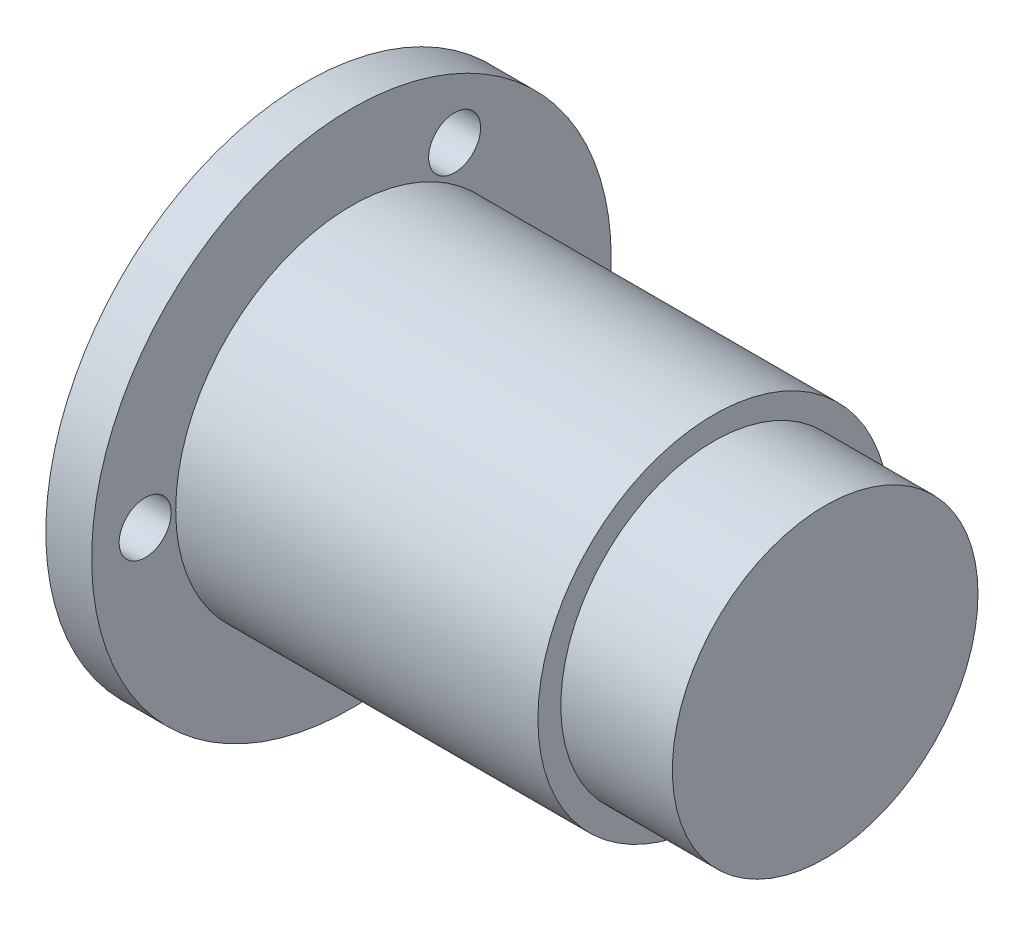
ISO-10303-21;
HEADER;
FILE_DESCRIPTION(('STEP AP214'),'2;1');
FILE_NAME('part.step','',(''),(''),'','','');
FILE_SCHEMA(('AUTOMOTIVE_DESIGN { 1 0 10303 214 1 1 1 1 }'));
ENDSEC;
DATA;
#1=APPLICATION_CONTEXT('core data for automotive mechanical design processes');
#2=APPLICATION_PROTOCOL_DEFINITION('international standard','automotive_design',2000,#1);
#3=PRODUCT_CONTEXT('',#1,'mechanical');
#4=PRODUCT('Part','Part','',(#3));
#5=PRODUCT_RELATED_PRODUCT_CATEGORY('part','',(#4));
#6=PRODUCT_DEFINITION_FORMATION('','',#4);
#7=PRODUCT_DEFINITION_CONTEXT('part definition',#1,'design');
#8=PRODUCT_DEFINITION('design','',#6,#7);
#9=PRODUCT_DEFINITION_SHAPE('','',#8);
#10=(LENGTH_UNIT() NAMED_UNIT(*) SI_UNIT(.MILLI.,.METRE.));
#11=(NAMED_UNIT(*) PLANE_ANGLE_UNIT() SI_UNIT($,.RADIAN.));
#12=(NAMED_UNIT(*) SI_UNIT($,.STERADIAN.) SOLID_ANGLE_UNIT());
#13=UNCERTAINTY_MEASURE_WITH_UNIT(LENGTH_MEASURE(1.E-05),#10,'distance_accuracy_value','');
#14=(GEOMETRIC_REPRESENTATION_CONTEXT(3) GLOBAL_UNCERTAINTY_ASSIGNED_CONTEXT((#13)) GLOBAL_UNIT_ASSIGNED_CONTEXT((#10,
#11,#12)) REPRESENTATION_CONTEXT('',''));
#15=CARTESIAN_POINT('',(0.,0.,0.));
#16=DIRECTION('',(0.,0.,1.));
#17=DIRECTION('',(1.,0.,0.));
#18=AXIS2_PLACEMENT_3D('',#15,#16,#17);
#19=CARTESIAN_POINT('',(-29.5,0.,0.));
#20=DIRECTION('',(1.,0.,0.));
#21=DIRECTION('',(0.,0.,1.));
#22=AXIS2_PLACEMENT_3D('',#19,#20,#21);
#23=PLANE('',#22);
#24=CARTESIAN_POINT('',(-29.5,0.,0.));
#25=DIRECTION('',(1.,0.,0.));
#26=DIRECTION('',(0.,0.,-1.));
#27=AXIS2_PLACEMENT_3D('',#24,#25,#26);
#28=CIRCLE('',#27,10.);
#29=CARTESIAN_POINT('',(-29.5,0.,-10.));
#30=VERTEX_POINT('',#29);
#31=EDGE_CURVE('E9',#30,#30,#28,.T.);
#32=ORIENTED_EDGE('',*,*,#31,.T.);
#33=EDGE_LOOP('',(#32));
#34=FACE_BOUND('',#33,.T.);
#35=ADVANCED_FACE('F14',(#34),#23,.T.);
#36=CARTESIAN_POINT('',(-36.81,0.,0.));
#37=DIRECTION('',(1.,0.,0.));
#38=DIRECTION('',(0.,0.,-1.));
#39=AXIS2_PLACEMENT_3D('',#36,#37,#38);
#40=CYLINDRICAL_SURFACE('',#39,10.);
#41=DIRECTION('',(1.,0.,0.));
#42=VECTOR('',#41,1.);
#43=CARTESIAN_POINT('',(-36.81,0.,-10.));
#44=LINE('',#43,#42);
#45=CARTESIAN_POINT('',(-36.8,0.,-10.));
#46=VERTEX_POINT('',#45);
#47=EDGE_CURVE('E24',#46,#30,#44,.T.);
#48=ORIENTED_EDGE('',*,*,#47,.T.);
#49=ORIENTED_EDGE('',*,*,#31,.F.);
#50=ORIENTED_EDGE('',*,*,#47,.F.);
#51=CARTESIAN_POINT('',(-36.8,0.,0.));
#52=DIRECTION('',(1.,0.,0.));
#53=DIRECTION('',(0.,0.,-1.));
#54=AXIS2_PLACEMENT_3D('',#51,#52,#53);
#55=CIRCLE('',#54,10.);
#56=EDGE_CURVE('E122',#46,#46,#55,.T.);
#57=ORIENTED_EDGE('',*,*,#56,.T.);
#58=EDGE_LOOP('',(#48,#49,#50,#57));
#59=FACE_BOUND('',#58,.T.);
#60=ADVANCED_FACE('F178',(#59),#40,.T.);
#61=CARTESIAN_POINT('',(-36.8,0.,0.));
#62=DIRECTION('',(1.,0.,0.));
#63=DIRECTION('',(0.,0.,1.));
#64=AXIS2_PLACEMENT_3D('',#61,#62,#63);
#65=PLANE('',#64);
#66=ORIENTED_EDGE('',*,*,#56,.F.);
#67=EDGE_LOOP('',(#66));
#68=FACE_BOUND('',#67,.T.);
#69=CARTESIAN_POINT('',(-36.8,0.,0.));
#70=DIRECTION('',(1.,0.,0.));
#71=DIRECTION('',(0.,0.,-1.));
#72=AXIS2_PLACEMENT_3D('',#69,#70,#71);
#73=CIRCLE('',#72,11.5);
#74=CARTESIAN_POINT('',(-36.8,0.,-11.5));
#75=VERTEX_POINT('',#74);
#76=EDGE_CURVE('E102',#75,#75,#73,.T.);
#77=ORIENTED_EDGE('',*,*,#76,.T.);
#78=EDGE_LOOP('',(#77));
#79=FACE_BOUND('',#78,.T.);
#80=ADVANCED_FACE('F182',(#68,#79),#65,.T.);
#81=CARTESIAN_POINT('',(-63.6,11.69134295109,-6.75));
#82=DIRECTION('',(1.,0.,0.));
#83=DIRECTION('',(0.,0.,-1.));
#84=AXIS2_PLACEMENT_3D('',#81,#82,#83);
#85=CYLINDRICAL_SURFACE('',#84,1.7);
#86=DIRECTION('',(1.,0.,0.));
#87=VECTOR('',#86,1.);
#88=CARTESIAN_POINT('',(-63.6,11.69134295109,-8.45));
#89=LINE('',#88,#87);
#90=CARTESIAN_POINT('',(-63.5,11.69134295109,-8.45));
#91=VERTEX_POINT('',#90);
#92=CARTESIAN_POINT('',(-60.5,11.69134295109,-8.45));
#93=VERTEX_POINT('',#92);
#94=EDGE_CURVE('E87',#91,#93,#89,.T.);
#95=ORIENTED_EDGE('',*,*,#94,.F.);
#96=CARTESIAN_POINT('',(-63.5,11.69134295109,-6.75));
#97=DIRECTION('',(1.,0.,0.));
#98=DIRECTION('',(0.,0.,-1.));
#99=AXIS2_PLACEMENT_3D('',#96,#97,#98);
#100=CIRCLE('',#99,1.7);
#101=EDGE_CURVE('E108',#91,#91,#100,.T.);
#102=ORIENTED_EDGE('',*,*,#101,.F.);
#103=ORIENTED_EDGE('',*,*,#94,.T.);
#104=CARTESIAN_POINT('',(-60.5,11.69134295109,-6.75));
#105=DIRECTION('',(1.,0.,0.));
#106=DIRECTION('',(0.,0.,-1.));
#107=AXIS2_PLACEMENT_3D('',#104,#105,#106);
#108=CIRCLE('',#107,1.7);
#109=EDGE_CURVE('E118',#93,#93,#108,.T.);
#110=ORIENTED_EDGE('',*,*,#109,.T.);
#111=EDGE_LOOP('',(#95,#102,#103,#110));
#112=FACE_BOUND('',#111,.T.);
#113=ADVANCED_FACE('F188',(#112),#85,.F.);
#114=CARTESIAN_POINT('',(-60.5,0.,0.));
#115=DIRECTION('',(1.,0.,0.));
#116=DIRECTION('',(0.,0.,-1.));
#117=AXIS2_PLACEMENT_3D('',#114,#115,#116);
#118=CYLINDRICAL_SURFACE('',#117,11.5);
#119=ORIENTED_EDGE('',*,*,#76,.F.);
#120=DIRECTION('',(1.,0.,0.));
#121=VECTOR('',#120,1.);
#122=CARTESIAN_POINT('',(-60.5,0.,-11.5));
#123=LINE('',#122,#121);
#124=CARTESIAN_POINT('',(-60.5,0.,-11.5));
#125=VERTEX_POINT('',#124);
#126=EDGE_CURVE('E129',#125,#75,#123,.T.);
#127=ORIENTED_EDGE('',*,*,#126,.F.);
#128=CARTESIAN_POINT('',(-60.5,0.,0.));
#129=DIRECTION('',(1.,0.,0.));
#130=DIRECTION('',(0.,0.,-1.));
#131=AXIS2_PLACEMENT_3D('',#128,#129,#130);
#132=CIRCLE('',#131,11.5);
#133=EDGE_CURVE('E17',#125,#125,#132,.T.);
#134=ORIENTED_EDGE('',*,*,#133,.T.);
#135=ORIENTED_EDGE('',*,*,#126,.T.);
#136=EDGE_LOOP('',(#119,#127,#134,#135));
#137=FACE_BOUND('',#136,.T.);
#138=ADVANCED_FACE('F158',(#137),#118,.T.);
#139=CARTESIAN_POINT('',(-63.6,0.,13.5));
#140=DIRECTION('',(1.,0.,0.));
#141=DIRECTION('',(0.,0.,-1.));
#142=AXIS2_PLACEMENT_3D('',#139,#140,#141);
#143=CYLINDRICAL_SURFACE('',#142,1.7);
#144=DIRECTION('',(1.,0.,0.));
#145=VECTOR('',#144,1.);
#146=CARTESIAN_POINT('',(-63.6,0.,11.8));
#147=LINE('',#146,#145);
#148=CARTESIAN_POINT('',(-63.5,0.,11.8));
#149=VERTEX_POINT('',#148);
#150=CARTESIAN_POINT('',(-60.5,0.,11.8));
#151=VERTEX_POINT('',#150);
#152=EDGE_CURVE('E95',#149,#151,#147,.T.);
#153=ORIENTED_EDGE('',*,*,#152,.F.);
#154=CARTESIAN_POINT('',(-63.5,0.,13.5));
#155=DIRECTION('',(1.,0.,0.));
#156=DIRECTION('',(0.,0.,-1.));
#157=AXIS2_PLACEMENT_3D('',#154,#155,#156);
#158=CIRCLE('',#157,1.7);
#159=EDGE_CURVE('E98',#149,#149,#158,.T.);
#160=ORIENTED_EDGE('',*,*,#159,.F.);
#161=ORIENTED_EDGE('',*,*,#152,.T.);
#162=CARTESIAN_POINT('',(-60.5,0.,13.5));
#163=DIRECTION('',(1.,0.,0.));
#164=DIRECTION('',(0.,0.,-1.));
#165=AXIS2_PLACEMENT_3D('',#162,#163,#164);
#166=CIRCLE('',#165,1.7);
#167=EDGE_CURVE('E100',#151,#151,#166,.T.);
#168=ORIENTED_EDGE('',*,*,#167,.T.);
#169=EDGE_LOOP('',(#153,#160,#161,#168));
#170=FACE_BOUND('',#169,.T.);
#171=ADVANCED_FACE('F97',(#170),#143,.F.);
#172=CARTESIAN_POINT('',(-63.6,-11.69134295109,-6.75));
#173=DIRECTION('',(1.,0.,0.));
#174=DIRECTION('',(0.,0.,-1.));
#175=AXIS2_PLACEMENT_3D('',#172,#173,#174);
#176=CYLINDRICAL_SURFACE('',#175,1.7);
#177=DIRECTION('',(1.,0.,0.));
#178=VECTOR('',#177,1.);
#179=CARTESIAN_POINT('',(-63.6,-11.69134295109,-8.45));
#180=LINE('',#179,#178);
#181=CARTESIAN_POINT('',(-63.5,-11.69134295109,-8.45));
#182=VERTEX_POINT('',#181);
#183=CARTESIAN_POINT('',(-60.5,-11.69134295109,-8.45));
#184=VERTEX_POINT('',#183);
#185=EDGE_CURVE('E70',#182,#184,#180,.T.);
#186=ORIENTED_EDGE('',*,*,#185,.F.);
#187=CARTESIAN_POINT('',(-63.5,-11.69134295109,-6.75));
#188=DIRECTION('',(1.,0.,0.));
#189=DIRECTION('',(0.,0.,-1.));
#190=AXIS2_PLACEMENT_3D('',#187,#188,#189);
#191=CIRCLE('',#190,1.7);
#192=EDGE_CURVE('E109',#182,#182,#191,.T.);
#193=ORIENTED_EDGE('',*,*,#192,.F.);
#194=ORIENTED_EDGE('',*,*,#185,.T.);
#195=CARTESIAN_POINT('',(-60.5,-11.69134295109,-6.75));
#196=DIRECTION('',(1.,0.,0.));
#197=DIRECTION('',(0.,0.,-1.));
#198=AXIS2_PLACEMENT_3D('',#195,#196,#197);
#199=CIRCLE('',#198,1.7);
#200=EDGE_CURVE('E127',#184,#184,#199,.T.);
#201=ORIENTED_EDGE('',*,*,#200,.T.);
#202=EDGE_LOOP('',(#186,#193,#194,#201));
#203=FACE_BOUND('',#202,.T.);
#204=ADVANCED_FACE('F198',(#203),#176,.F.);
#205=CARTESIAN_POINT('',(-63.5,0.,0.));
#206=DIRECTION('',(1.,0.,0.));
#207=DIRECTION('',(0.,0.,1.));
#208=AXIS2_PLACEMENT_3D('',#205,#206,#207);
#209=PLANE('',#208);
#210=ORIENTED_EDGE('',*,*,#101,.T.);
#211=EDGE_LOOP('',(#210));
#212=FACE_BOUND('',#211,.T.);
#213=ORIENTED_EDGE('',*,*,#159,.T.);
#214=EDGE_LOOP('',(#213));
#215=FACE_BOUND('',#214,.T.);
#216=ORIENTED_EDGE('',*,*,#192,.T.);
#217=EDGE_LOOP('',(#216));
#218=FACE_BOUND('',#217,.T.);
#219=CARTESIAN_POINT('',(-63.5,0.,0.));
#220=DIRECTION('',(1.,0.,0.));
#221=DIRECTION('',(0.,0.,-1.));
#222=AXIS2_PLACEMENT_3D('',#219,#220,#221);
#223=CIRCLE('',#222,17.);
#224=CARTESIAN_POINT('',(-63.5,0.,-17.));
#225=VERTEX_POINT('',#224);
#226=EDGE_CURVE('E81',#225,#225,#223,.T.);
#227=ORIENTED_EDGE('',*,*,#226,.F.);
#228=EDGE_LOOP('',(#227));
#229=FACE_BOUND('',#228,.T.);
#230=ADVANCED_FACE('F105',(#212,#215,#218,#229),#209,.F.);
#231=CARTESIAN_POINT('',(-60.5,0.,0.));
#232=DIRECTION('',(1.,0.,0.));
#233=DIRECTION('',(0.,0.,1.));
#234=AXIS2_PLACEMENT_3D('',#231,#232,#233);
#235=PLANE('',#234);
#236=ORIENTED_EDGE('',*,*,#109,.F.);
#237=EDGE_LOOP('',(#236));
#238=FACE_BOUND('',#237,.T.);
#239=ORIENTED_EDGE('',*,*,#133,.F.);
#240=EDGE_LOOP('',(#239));
#241=FACE_BOUND('',#240,.T.);
#242=ORIENTED_EDGE('',*,*,#167,.F.);
#243=EDGE_LOOP('',(#242));
#244=FACE_BOUND('',#243,.T.);
#245=ORIENTED_EDGE('',*,*,#200,.F.);
#246=EDGE_LOOP('',(#245));
#247=FACE_BOUND('',#246,.T.);
#248=CARTESIAN_POINT('',(-60.5,0.,0.));
#249=DIRECTION('',(1.,0.,0.));
#250=DIRECTION('',(0.,0.,-1.));
#251=AXIS2_PLACEMENT_3D('',#248,#249,#250);
#252=CIRCLE('',#251,17.);
#253=CARTESIAN_POINT('',(-60.5,0.,-17.));
#254=VERTEX_POINT('',#253);
#255=EDGE_CURVE('E125',#254,#254,#252,.T.);
#256=ORIENTED_EDGE('',*,*,#255,.T.);
#257=EDGE_LOOP('',(#256));
#258=FACE_BOUND('',#257,.T.);
#259=ADVANCED_FACE('F160',(#238,#241,#244,#247,#258),#235,.T.);
#260=CARTESIAN_POINT('',(-63.5,0.,0.));
#261=DIRECTION('',(1.,0.,0.));
#262=DIRECTION('',(0.,0.,-1.));
#263=AXIS2_PLACEMENT_3D('',#260,#261,#262);
#264=CYLINDRICAL_SURFACE('',#263,17.);
#265=ORIENTED_EDGE('',*,*,#255,.F.);
#266=DIRECTION('',(1.,0.,0.));
#267=VECTOR('',#266,1.);
#268=CARTESIAN_POINT('',(-63.5,0.,-17.));
#269=LINE('',#268,#267);
#270=EDGE_CURVE('E123',#225,#254,#269,.T.);
#271=ORIENTED_EDGE('',*,*,#270,.F.);
#272=ORIENTED_EDGE('',*,*,#226,.T.);
#273=ORIENTED_EDGE('',*,*,#270,.T.);
#274=EDGE_LOOP('',(#265,#271,#272,#273));
#275=FACE_BOUND('',#274,.T.);
#276=ADVANCED_FACE('F163',(#275),#264,.T.);
#277=CLOSED_SHELL('',(#35,#60,#80,#113,#138,#171,#204,#230,#259,#276));
#278=MANIFOLD_SOLID_BREP('B1',#277);
#279=ADVANCED_BREP_SHAPE_REPRESENTATION('',(#18,#278),#14);
#280=SHAPE_DEFINITION_REPRESENTATION(#9,#279);
ENDSEC;
END-ISO-10303-21;
